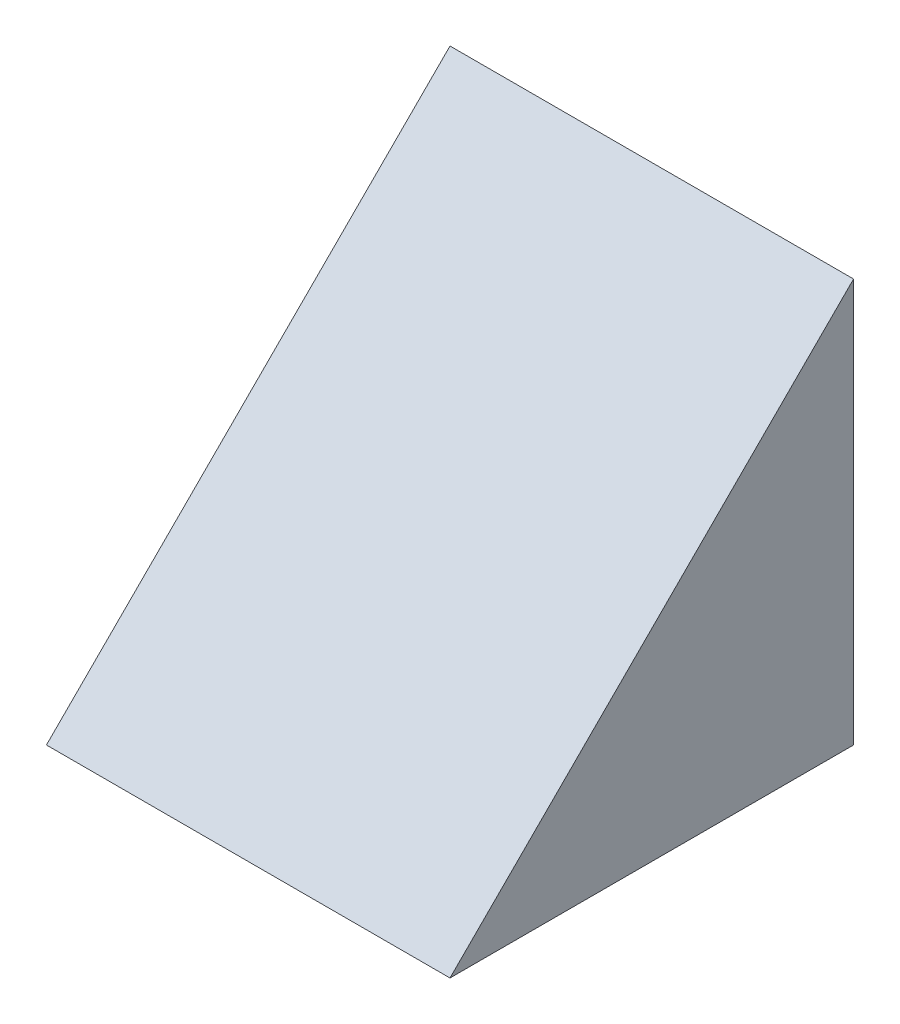
ISO-10303-21;
HEADER;
FILE_DESCRIPTION(('STEP AP214'),'2;1');
FILE_NAME('part.step','',(''),(''),'','','');
FILE_SCHEMA(('AUTOMOTIVE_DESIGN { 1 0 10303 214 1 1 1 1 }'));
ENDSEC;
DATA;
#1=APPLICATION_CONTEXT('core data for automotive mechanical design processes');
#2=APPLICATION_PROTOCOL_DEFINITION('international standard','automotive_design',2000,#1);
#3=PRODUCT_CONTEXT('',#1,'mechanical');
#4=PRODUCT('Part','Part','',(#3));
#5=PRODUCT_RELATED_PRODUCT_CATEGORY('part','',(#4));
#6=PRODUCT_DEFINITION_FORMATION('','',#4);
#7=PRODUCT_DEFINITION_CONTEXT('part definition',#1,'design');
#8=PRODUCT_DEFINITION('design','',#6,#7);
#9=PRODUCT_DEFINITION_SHAPE('','',#8);
#10=(LENGTH_UNIT() NAMED_UNIT(*) SI_UNIT(.MILLI.,.METRE.));
#11=(NAMED_UNIT(*) PLANE_ANGLE_UNIT() SI_UNIT($,.RADIAN.));
#12=(NAMED_UNIT(*) SI_UNIT($,.STERADIAN.) SOLID_ANGLE_UNIT());
#13=UNCERTAINTY_MEASURE_WITH_UNIT(LENGTH_MEASURE(1.E-05),#10,'distance_accuracy_value','');
#14=(GEOMETRIC_REPRESENTATION_CONTEXT(3) GLOBAL_UNCERTAINTY_ASSIGNED_CONTEXT((#13)) GLOBAL_UNIT_ASSIGNED_CONTEXT((#10,
#11,#12)) REPRESENTATION_CONTEXT('',''));
#15=CARTESIAN_POINT('',(0.,0.,0.));
#16=DIRECTION('',(0.,0.,1.));
#17=DIRECTION('',(1.,0.,0.));
#18=AXIS2_PLACEMENT_3D('',#15,#16,#17);
#19=CARTESIAN_POINT('',(1.,0.5,-0.5));
#20=DIRECTION('',(0.,0.,1.));
#21=DIRECTION('',(0.,-1.,0.));
#22=AXIS2_PLACEMENT_3D('',#19,#20,#21);
#23=PLANE('',#22);
#24=DIRECTION('',(0.,1.,0.));
#25=VECTOR('',#24,1.);
#26=CARTESIAN_POINT('',(0.,0.5,-0.5));
#27=LINE('',#26,#25);
#28=CARTESIAN_POINT('',(0.,-0.5,-0.5));
#29=VERTEX_POINT('',#28);
#30=CARTESIAN_POINT('',(0.,0.5,-0.5));
#31=VERTEX_POINT('',#30);
#32=EDGE_CURVE('E80',#29,#31,#27,.T.);
#33=ORIENTED_EDGE('',*,*,#32,.T.);
#34=DIRECTION('',(-1.,0.,0.));
#35=VECTOR('',#34,1.);
#36=CARTESIAN_POINT('',(1.,0.5,-0.5));
#37=LINE('',#36,#35);
#38=CARTESIAN_POINT('',(1.,0.5,-0.5));
#39=VERTEX_POINT('',#38);
#40=EDGE_CURVE('E11',#39,#31,#37,.T.);
#41=ORIENTED_EDGE('',*,*,#40,.F.);
#42=DIRECTION('',(0.,1.,0.));
#43=VECTOR('',#42,1.);
#44=CARTESIAN_POINT('',(1.,0.5,-0.5));
#45=LINE('',#44,#43);
#46=CARTESIAN_POINT('',(1.,-0.5,-0.5));
#47=VERTEX_POINT('',#46);
#48=EDGE_CURVE('E73',#47,#39,#45,.T.);
#49=ORIENTED_EDGE('',*,*,#48,.F.);
#50=DIRECTION('',(-1.,0.,0.));
#51=VECTOR('',#50,1.);
#52=CARTESIAN_POINT('',(1.,-0.5,-0.5));
#53=LINE('',#52,#51);
#54=EDGE_CURVE('E81',#47,#29,#53,.T.);
#55=ORIENTED_EDGE('',*,*,#54,.T.);
#56=EDGE_LOOP('',(#33,#41,#49,#55));
#57=FACE_BOUND('',#56,.T.);
#58=ADVANCED_FACE('F33',(#57),#23,.F.);
#59=CARTESIAN_POINT('',(1.,-0.5,0.5));
#60=DIRECTION('',(0.,-0.707106781186547,-0.707106781186547));
#61=DIRECTION('',(0.,0.707106781186548,-0.707106781186548));
#62=AXIS2_PLACEMENT_3D('',#59,#60,#61);
#63=PLANE('',#62);
#64=DIRECTION('',(0.,-0.707106781186548,0.707106781186548));
#65=VECTOR('',#64,1.);
#66=CARTESIAN_POINT('',(0.,-0.5,0.5));
#67=LINE('',#66,#65);
#68=CARTESIAN_POINT('',(0.,-0.5,0.5));
#69=VERTEX_POINT('',#68);
#70=EDGE_CURVE('E61',#31,#69,#67,.T.);
#71=ORIENTED_EDGE('',*,*,#70,.T.);
#72=DIRECTION('',(-1.,0.,0.));
#73=VECTOR('',#72,1.);
#74=CARTESIAN_POINT('',(1.,-0.5,0.5));
#75=LINE('',#74,#73);
#76=CARTESIAN_POINT('',(1.,-0.5,0.5));
#77=VERTEX_POINT('',#76);
#78=EDGE_CURVE('E41',#77,#69,#75,.T.);
#79=ORIENTED_EDGE('',*,*,#78,.F.);
#80=DIRECTION('',(0.,-0.707106781186548,0.707106781186548));
#81=VECTOR('',#80,1.);
#82=CARTESIAN_POINT('',(1.,-0.5,0.5));
#83=LINE('',#82,#81);
#84=EDGE_CURVE('E69',#39,#77,#83,.T.);
#85=ORIENTED_EDGE('',*,*,#84,.F.);
#86=ORIENTED_EDGE('',*,*,#40,.T.);
#87=EDGE_LOOP('',(#71,#79,#85,#86));
#88=FACE_BOUND('',#87,.T.);
#89=ADVANCED_FACE('F70',(#88),#63,.F.);
#90=CARTESIAN_POINT('',(1.,-0.5,0.5));
#91=DIRECTION('',(0.,1.,0.));
#92=DIRECTION('',(0.,0.,1.));
#93=AXIS2_PLACEMENT_3D('',#90,#91,#92);
#94=PLANE('',#93);
#95=DIRECTION('',(0.,0.,-1.));
#96=VECTOR('',#95,1.);
#97=CARTESIAN_POINT('',(0.,-0.5,0.5));
#98=LINE('',#97,#96);
#99=EDGE_CURVE('E66',#69,#29,#98,.T.);
#100=ORIENTED_EDGE('',*,*,#99,.T.);
#101=ORIENTED_EDGE('',*,*,#54,.F.);
#102=DIRECTION('',(0.,0.,-1.));
#103=VECTOR('',#102,1.);
#104=CARTESIAN_POINT('',(1.,-0.5,0.5));
#105=LINE('',#104,#103);
#106=EDGE_CURVE('E49',#77,#47,#105,.T.);
#107=ORIENTED_EDGE('',*,*,#106,.F.);
#108=ORIENTED_EDGE('',*,*,#78,.T.);
#109=EDGE_LOOP('',(#100,#101,#107,#108));
#110=FACE_BOUND('',#109,.T.);
#111=ADVANCED_FACE('F88',(#110),#94,.F.);
#112=CARTESIAN_POINT('',(1.,0.,0.));
#113=DIRECTION('',(1.,0.,0.));
#114=DIRECTION('',(0.,0.,-1.));
#115=AXIS2_PLACEMENT_3D('',#112,#113,#114);
#116=PLANE('',#115);
#117=ORIENTED_EDGE('',*,*,#48,.T.);
#118=ORIENTED_EDGE('',*,*,#84,.T.);
#119=ORIENTED_EDGE('',*,*,#106,.T.);
#120=EDGE_LOOP('',(#117,#118,#119));
#121=FACE_BOUND('',#120,.T.);
#122=ADVANCED_FACE('F76',(#121),#116,.T.);
#123=CARTESIAN_POINT('',(0.,0.,0.));
#124=DIRECTION('',(1.,0.,0.));
#125=DIRECTION('',(0.,0.,-1.));
#126=AXIS2_PLACEMENT_3D('',#123,#124,#125);
#127=PLANE('',#126);
#128=ORIENTED_EDGE('',*,*,#32,.F.);
#129=ORIENTED_EDGE('',*,*,#99,.F.);
#130=ORIENTED_EDGE('',*,*,#70,.F.);
#131=EDGE_LOOP('',(#128,#129,#130));
#132=FACE_BOUND('',#131,.T.);
#133=ADVANCED_FACE('F89',(#132),#127,.F.);
#134=CLOSED_SHELL('',(#58,#89,#111,#122,#133));
#135=MANIFOLD_SOLID_BREP('B2',#134);
#136=ADVANCED_BREP_SHAPE_REPRESENTATION('',(#18,#135),#14);
#137=SHAPE_DEFINITION_REPRESENTATION(#9,#136);
ENDSEC;
END-ISO-10303-21;
